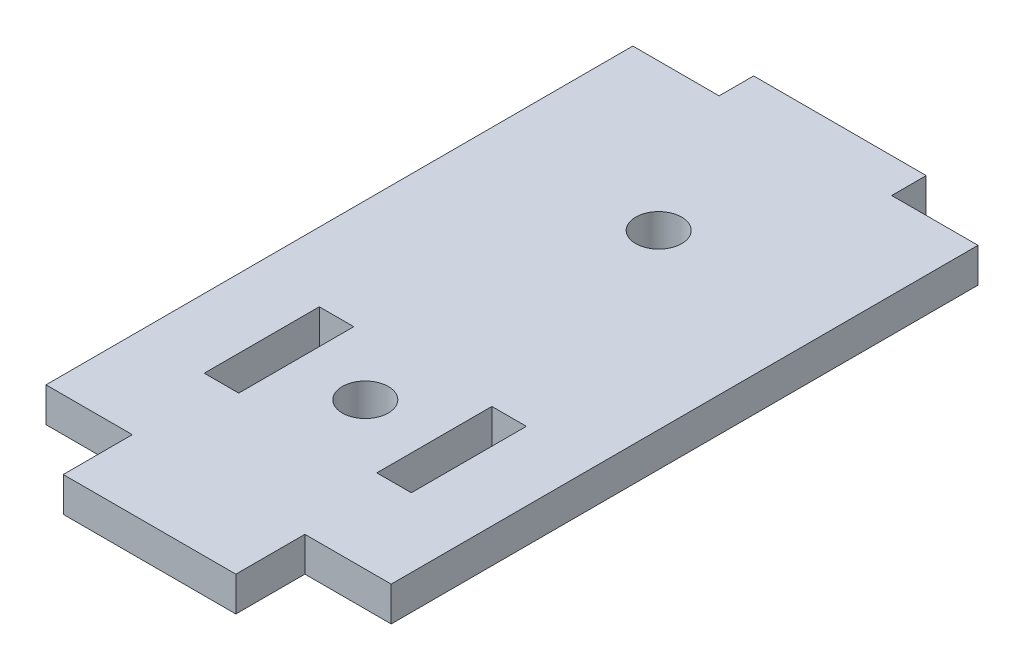
ISO-10303-21;
HEADER;
FILE_DESCRIPTION(('STEP AP214'),'2;1');
FILE_NAME('part.step','',(''),(''),'','','');
FILE_SCHEMA(('AUTOMOTIVE_DESIGN { 1 0 10303 214 1 1 1 1 }'));
ENDSEC;
DATA;
#1=APPLICATION_CONTEXT('core data for automotive mechanical design processes');
#2=APPLICATION_PROTOCOL_DEFINITION('international standard','automotive_design',2000,#1);
#3=PRODUCT_CONTEXT('',#1,'mechanical');
#4=PRODUCT('Part','Part','',(#3));
#5=PRODUCT_RELATED_PRODUCT_CATEGORY('part','',(#4));
#6=PRODUCT_DEFINITION_FORMATION('','',#4);
#7=PRODUCT_DEFINITION_CONTEXT('part definition',#1,'design');
#8=PRODUCT_DEFINITION('design','',#6,#7);
#9=PRODUCT_DEFINITION_SHAPE('','',#8);
#10=(LENGTH_UNIT() NAMED_UNIT(*) SI_UNIT(.MILLI.,.METRE.));
#11=(NAMED_UNIT(*) PLANE_ANGLE_UNIT() SI_UNIT($,.RADIAN.));
#12=(NAMED_UNIT(*) SI_UNIT($,.STERADIAN.) SOLID_ANGLE_UNIT());
#13=UNCERTAINTY_MEASURE_WITH_UNIT(LENGTH_MEASURE(1.E-05),#10,'distance_accuracy_value','');
#14=(GEOMETRIC_REPRESENTATION_CONTEXT(3) GLOBAL_UNCERTAINTY_ASSIGNED_CONTEXT((#13)) GLOBAL_UNIT_ASSIGNED_CONTEXT((#10,
#11,#12)) REPRESENTATION_CONTEXT('',''));
#15=CARTESIAN_POINT('',(0.,0.,0.));
#16=DIRECTION('',(0.,0.,1.));
#17=DIRECTION('',(1.,0.,0.));
#18=AXIS2_PLACEMENT_3D('',#15,#16,#17);
#19=CARTESIAN_POINT('',(0.,3.,17.75));
#20=DIRECTION('',(0.,0.,1.));
#21=DIRECTION('',(1.,0.,0.));
#22=AXIS2_PLACEMENT_3D('',#19,#20,#21);
#23=PLANE('',#22);
#24=DIRECTION('',(-1.,0.,0.));
#25=VECTOR('',#24,1.);
#26=CARTESIAN_POINT('',(0.,0.,17.75));
#27=LINE('',#26,#25);
#28=CARTESIAN_POINT('',(-6.,0.,17.75));
#29=VERTEX_POINT('',#28);
#30=CARTESIAN_POINT('',(-9.,0.,17.75));
#31=VERTEX_POINT('',#30);
#32=EDGE_CURVE('E254',#29,#31,#27,.T.);
#33=ORIENTED_EDGE('',*,*,#32,.T.);
#34=DIRECTION('',(0.,-1.,0.));
#35=VECTOR('',#34,1.);
#36=CARTESIAN_POINT('',(-9.,3.,17.75));
#37=LINE('',#36,#35);
#38=CARTESIAN_POINT('',(-9.,3.,17.75));
#39=VERTEX_POINT('',#38);
#40=EDGE_CURVE('E11',#39,#31,#37,.T.);
#41=ORIENTED_EDGE('',*,*,#40,.F.);
#42=DIRECTION('',(-1.,0.,0.));
#43=VECTOR('',#42,1.);
#44=CARTESIAN_POINT('',(0.,3.,17.75));
#45=LINE('',#44,#43);
#46=CARTESIAN_POINT('',(-6.,3.,17.75));
#47=VERTEX_POINT('',#46);
#48=EDGE_CURVE('E186',#47,#39,#45,.T.);
#49=ORIENTED_EDGE('',*,*,#48,.F.);
#50=DIRECTION('',(0.,-1.,0.));
#51=VECTOR('',#50,1.);
#52=CARTESIAN_POINT('',(-6.,3.,17.75));
#53=LINE('',#52,#51);
#54=EDGE_CURVE('E54',#47,#29,#53,.T.);
#55=ORIENTED_EDGE('',*,*,#54,.T.);
#56=EDGE_LOOP('',(#33,#41,#49,#55));
#57=FACE_BOUND('',#56,.T.);
#58=ADVANCED_FACE('F35',(#57),#23,.F.);
#59=CARTESIAN_POINT('',(-9.,3.,0.));
#60=DIRECTION('',(-1.,0.,0.));
#61=DIRECTION('',(0.,0.,1.));
#62=AXIS2_PLACEMENT_3D('',#59,#60,#61);
#63=PLANE('',#62);
#64=DIRECTION('',(0.,0.,-1.));
#65=VECTOR('',#64,1.);
#66=CARTESIAN_POINT('',(-9.,0.,0.));
#67=LINE('',#66,#65);
#68=CARTESIAN_POINT('',(-9.,0.,7.75));
#69=VERTEX_POINT('',#68);
#70=EDGE_CURVE('E192',#31,#69,#67,.T.);
#71=ORIENTED_EDGE('',*,*,#70,.T.);
#72=DIRECTION('',(0.,-1.,0.));
#73=VECTOR('',#72,1.);
#74=CARTESIAN_POINT('',(-9.,3.,7.75));
#75=LINE('',#74,#73);
#76=CARTESIAN_POINT('',(-9.,3.,7.75));
#77=VERTEX_POINT('',#76);
#78=EDGE_CURVE('E45',#77,#69,#75,.T.);
#79=ORIENTED_EDGE('',*,*,#78,.F.);
#80=DIRECTION('',(0.,0.,-1.));
#81=VECTOR('',#80,1.);
#82=CARTESIAN_POINT('',(-9.,3.,0.));
#83=LINE('',#82,#81);
#84=EDGE_CURVE('E180',#39,#77,#83,.T.);
#85=ORIENTED_EDGE('',*,*,#84,.F.);
#86=ORIENTED_EDGE('',*,*,#40,.T.);
#87=EDGE_LOOP('',(#71,#79,#85,#86));
#88=FACE_BOUND('',#87,.T.);
#89=ADVANCED_FACE('F191',(#88),#63,.F.);
#90=CARTESIAN_POINT('',(0.,3.,7.75));
#91=DIRECTION('',(0.,0.,1.));
#92=DIRECTION('',(1.,0.,0.));
#93=AXIS2_PLACEMENT_3D('',#90,#91,#92);
#94=PLANE('',#93);
#95=DIRECTION('',(-1.,0.,0.));
#96=VECTOR('',#95,1.);
#97=CARTESIAN_POINT('',(0.,0.,7.75));
#98=LINE('',#97,#96);
#99=CARTESIAN_POINT('',(-6.,0.,7.75));
#100=VERTEX_POINT('',#99);
#101=EDGE_CURVE('E257',#100,#69,#98,.T.);
#102=ORIENTED_EDGE('',*,*,#101,.F.);
#103=DIRECTION('',(0.,-1.,0.));
#104=VECTOR('',#103,1.);
#105=CARTESIAN_POINT('',(-6.,3.,7.75));
#106=LINE('',#105,#104);
#107=CARTESIAN_POINT('',(-6.,3.,7.75));
#108=VERTEX_POINT('',#107);
#109=EDGE_CURVE('E116',#108,#100,#106,.T.);
#110=ORIENTED_EDGE('',*,*,#109,.F.);
#111=DIRECTION('',(-1.,0.,0.));
#112=VECTOR('',#111,1.);
#113=CARTESIAN_POINT('',(0.,3.,7.75));
#114=LINE('',#113,#112);
#115=EDGE_CURVE('E185',#108,#77,#114,.T.);
#116=ORIENTED_EDGE('',*,*,#115,.T.);
#117=ORIENTED_EDGE('',*,*,#78,.T.);
#118=EDGE_LOOP('',(#102,#110,#116,#117));
#119=FACE_BOUND('',#118,.T.);
#120=ADVANCED_FACE('F196',(#119),#94,.T.);
#121=CARTESIAN_POINT('',(0.,3.,17.75));
#122=DIRECTION('',(0.,0.,-1.));
#123=DIRECTION('',(-1.,0.,0.));
#124=AXIS2_PLACEMENT_3D('',#121,#122,#123);
#125=PLANE('',#124);
#126=DIRECTION('',(1.,0.,0.));
#127=VECTOR('',#126,1.);
#128=CARTESIAN_POINT('',(0.,0.,17.75));
#129=LINE('',#128,#127);
#130=CARTESIAN_POINT('',(6.,0.,17.75));
#131=VERTEX_POINT('',#130);
#132=CARTESIAN_POINT('',(9.,0.,17.75));
#133=VERTEX_POINT('',#132);
#134=EDGE_CURVE('E236',#131,#133,#129,.T.);
#135=ORIENTED_EDGE('',*,*,#134,.F.);
#136=DIRECTION('',(0.,-1.,0.));
#137=VECTOR('',#136,1.);
#138=CARTESIAN_POINT('',(6.,3.,17.75));
#139=LINE('',#138,#137);
#140=CARTESIAN_POINT('',(6.,3.,17.75));
#141=VERTEX_POINT('',#140);
#142=EDGE_CURVE('E264',#141,#131,#139,.T.);
#143=ORIENTED_EDGE('',*,*,#142,.F.);
#144=DIRECTION('',(1.,0.,0.));
#145=VECTOR('',#144,1.);
#146=CARTESIAN_POINT('',(0.,3.,17.75));
#147=LINE('',#146,#145);
#148=CARTESIAN_POINT('',(9.,3.,17.75));
#149=VERTEX_POINT('',#148);
#150=EDGE_CURVE('E347',#141,#149,#147,.T.);
#151=ORIENTED_EDGE('',*,*,#150,.T.);
#152=DIRECTION('',(0.,-1.,0.));
#153=VECTOR('',#152,1.);
#154=CARTESIAN_POINT('',(9.,3.,17.75));
#155=LINE('',#154,#153);
#156=EDGE_CURVE('E266',#149,#133,#155,.T.);
#157=ORIENTED_EDGE('',*,*,#156,.T.);
#158=EDGE_LOOP('',(#135,#143,#151,#157));
#159=FACE_BOUND('',#158,.T.);
#160=ADVANCED_FACE('F404',(#159),#125,.T.);
#161=CARTESIAN_POINT('',(6.,3.,0.));
#162=DIRECTION('',(-1.,0.,0.));
#163=DIRECTION('',(0.,0.,1.));
#164=AXIS2_PLACEMENT_3D('',#161,#162,#163);
#165=PLANE('',#164);
#166=DIRECTION('',(0.,0.,-1.));
#167=VECTOR('',#166,1.);
#168=CARTESIAN_POINT('',(6.,0.,0.));
#169=LINE('',#168,#167);
#170=CARTESIAN_POINT('',(6.,0.,7.75));
#171=VERTEX_POINT('',#170);
#172=EDGE_CURVE('E239',#131,#171,#169,.T.);
#173=ORIENTED_EDGE('',*,*,#172,.T.);
#174=DIRECTION('',(0.,-1.,0.));
#175=VECTOR('',#174,1.);
#176=CARTESIAN_POINT('',(6.,3.,7.75));
#177=LINE('',#176,#175);
#178=CARTESIAN_POINT('',(6.,3.,7.75));
#179=VERTEX_POINT('',#178);
#180=EDGE_CURVE('E270',#179,#171,#177,.T.);
#181=ORIENTED_EDGE('',*,*,#180,.F.);
#182=DIRECTION('',(0.,0.,-1.));
#183=VECTOR('',#182,1.);
#184=CARTESIAN_POINT('',(6.,3.,0.));
#185=LINE('',#184,#183);
#186=EDGE_CURVE('E350',#141,#179,#185,.T.);
#187=ORIENTED_EDGE('',*,*,#186,.F.);
#188=ORIENTED_EDGE('',*,*,#142,.T.);
#189=EDGE_LOOP('',(#173,#181,#187,#188));
#190=FACE_BOUND('',#189,.T.);
#191=ADVANCED_FACE('F400',(#190),#165,.F.);
#192=CARTESIAN_POINT('',(0.,3.,7.75));
#193=DIRECTION('',(0.,0.,-1.));
#194=DIRECTION('',(-1.,0.,0.));
#195=AXIS2_PLACEMENT_3D('',#192,#193,#194);
#196=PLANE('',#195);
#197=DIRECTION('',(1.,0.,0.));
#198=VECTOR('',#197,1.);
#199=CARTESIAN_POINT('',(0.,0.,7.75));
#200=LINE('',#199,#198);
#201=CARTESIAN_POINT('',(9.,0.,7.75));
#202=VERTEX_POINT('',#201);
#203=EDGE_CURVE('E242',#171,#202,#200,.T.);
#204=ORIENTED_EDGE('',*,*,#203,.T.);
#205=DIRECTION('',(0.,-1.,0.));
#206=VECTOR('',#205,1.);
#207=CARTESIAN_POINT('',(9.,3.,7.75));
#208=LINE('',#207,#206);
#209=CARTESIAN_POINT('',(9.,3.,7.75));
#210=VERTEX_POINT('',#209);
#211=EDGE_CURVE('E268',#210,#202,#208,.T.);
#212=ORIENTED_EDGE('',*,*,#211,.F.);
#213=DIRECTION('',(1.,0.,0.));
#214=VECTOR('',#213,1.);
#215=CARTESIAN_POINT('',(0.,3.,7.75));
#216=LINE('',#215,#214);
#217=EDGE_CURVE('E353',#179,#210,#216,.T.);
#218=ORIENTED_EDGE('',*,*,#217,.F.);
#219=ORIENTED_EDGE('',*,*,#180,.T.);
#220=EDGE_LOOP('',(#204,#212,#218,#219));
#221=FACE_BOUND('',#220,.T.);
#222=ADVANCED_FACE('F397',(#221),#196,.F.);
#223=CARTESIAN_POINT('',(0.,3.,31.5));
#224=DIRECTION('',(0.,0.,1.));
#225=DIRECTION('',(1.,0.,0.));
#226=AXIS2_PLACEMENT_3D('',#223,#224,#225);
#227=PLANE('',#226);
#228=DIRECTION('',(-1.,0.,0.));
#229=VECTOR('',#228,1.);
#230=CARTESIAN_POINT('',(0.,0.,31.5));
#231=LINE('',#230,#229);
#232=CARTESIAN_POINT('',(7.5,0.,31.5));
#233=VERTEX_POINT('',#232);
#234=CARTESIAN_POINT('',(-7.5,0.,31.5));
#235=VERTEX_POINT('',#234);
#236=EDGE_CURVE('E203',#233,#235,#231,.T.);
#237=ORIENTED_EDGE('',*,*,#236,.F.);
#238=DIRECTION('',(0.,-1.,0.));
#239=VECTOR('',#238,1.);
#240=CARTESIAN_POINT('',(7.5,3.,31.5));
#241=LINE('',#240,#239);
#242=CARTESIAN_POINT('',(7.5,3.,31.5));
#243=VERTEX_POINT('',#242);
#244=EDGE_CURVE('E39',#243,#233,#241,.T.);
#245=ORIENTED_EDGE('',*,*,#244,.F.);
#246=DIRECTION('',(-1.,0.,0.));
#247=VECTOR('',#246,1.);
#248=CARTESIAN_POINT('',(0.,3.,31.5));
#249=LINE('',#248,#247);
#250=CARTESIAN_POINT('',(-7.5,3.,31.5));
#251=VERTEX_POINT('',#250);
#252=EDGE_CURVE('E262',#243,#251,#249,.T.);
#253=ORIENTED_EDGE('',*,*,#252,.T.);
#254=DIRECTION('',(0.,-1.,0.));
#255=VECTOR('',#254,1.);
#256=CARTESIAN_POINT('',(-7.5,3.,31.5));
#257=LINE('',#256,#255);
#258=EDGE_CURVE('E199',#251,#235,#257,.T.);
#259=ORIENTED_EDGE('',*,*,#258,.T.);
#260=EDGE_LOOP('',(#237,#245,#253,#259));
#261=FACE_BOUND('',#260,.T.);
#262=ADVANCED_FACE('F37',(#261),#227,.T.);
#263=CARTESIAN_POINT('',(7.5,3.,0.));
#264=DIRECTION('',(1.,0.,0.));
#265=DIRECTION('',(0.,0.,-1.));
#266=AXIS2_PLACEMENT_3D('',#263,#264,#265);
#267=PLANE('',#266);
#268=DIRECTION('',(0.,0.,1.));
#269=VECTOR('',#268,1.);
#270=CARTESIAN_POINT('',(7.5,0.,0.));
#271=LINE('',#270,#269);
#272=CARTESIAN_POINT('',(7.5,0.,25.5));
#273=VERTEX_POINT('',#272);
#274=EDGE_CURVE('E206',#273,#233,#271,.T.);
#275=ORIENTED_EDGE('',*,*,#274,.F.);
#276=DIRECTION('',(0.,-1.,0.));
#277=VECTOR('',#276,1.);
#278=CARTESIAN_POINT('',(7.5,3.,25.5));
#279=LINE('',#278,#277);
#280=CARTESIAN_POINT('',(7.5,3.,25.5));
#281=VERTEX_POINT('',#280);
#282=EDGE_CURVE('E295',#281,#273,#279,.T.);
#283=ORIENTED_EDGE('',*,*,#282,.F.);
#284=DIRECTION('',(0.,0.,1.));
#285=VECTOR('',#284,1.);
#286=CARTESIAN_POINT('',(7.5,3.,0.));
#287=LINE('',#286,#285);
#288=EDGE_CURVE('E304',#281,#243,#287,.T.);
#289=ORIENTED_EDGE('',*,*,#288,.T.);
#290=ORIENTED_EDGE('',*,*,#244,.T.);
#291=EDGE_LOOP('',(#275,#283,#289,#290));
#292=FACE_BOUND('',#291,.T.);
#293=ADVANCED_FACE('F302',(#292),#267,.T.);
#294=CARTESIAN_POINT('',(0.,3.,25.5));
#295=DIRECTION('',(0.,0.,1.));
#296=DIRECTION('',(1.,0.,0.));
#297=AXIS2_PLACEMENT_3D('',#294,#295,#296);
#298=PLANE('',#297);
#299=DIRECTION('',(-1.,0.,0.));
#300=VECTOR('',#299,1.);
#301=CARTESIAN_POINT('',(0.,0.,25.5));
#302=LINE('',#301,#300);
#303=CARTESIAN_POINT('',(15.,0.,25.5));
#304=VERTEX_POINT('',#303);
#305=EDGE_CURVE('E209',#304,#273,#302,.T.);
#306=ORIENTED_EDGE('',*,*,#305,.F.);
#307=DIRECTION('',(0.,-1.,0.));
#308=VECTOR('',#307,1.);
#309=CARTESIAN_POINT('',(15.,3.,25.5));
#310=LINE('',#309,#308);
#311=CARTESIAN_POINT('',(15.,3.,25.5));
#312=VERTEX_POINT('',#311);
#313=EDGE_CURVE('E294',#312,#304,#310,.T.);
#314=ORIENTED_EDGE('',*,*,#313,.F.);
#315=DIRECTION('',(-1.,0.,0.));
#316=VECTOR('',#315,1.);
#317=CARTESIAN_POINT('',(0.,3.,25.5));
#318=LINE('',#317,#316);
#319=EDGE_CURVE('E315',#312,#281,#318,.T.);
#320=ORIENTED_EDGE('',*,*,#319,.T.);
#321=ORIENTED_EDGE('',*,*,#282,.T.);
#322=EDGE_LOOP('',(#306,#314,#320,#321));
#323=FACE_BOUND('',#322,.T.);
#324=ADVANCED_FACE('F312',(#323),#298,.T.);
#325=CARTESIAN_POINT('',(15.,3.,0.));
#326=DIRECTION('',(-1.,0.,0.));
#327=DIRECTION('',(0.,0.,1.));
#328=AXIS2_PLACEMENT_3D('',#325,#326,#327);
#329=PLANE('',#328);
#330=DIRECTION('',(0.,0.,-1.));
#331=VECTOR('',#330,1.);
#332=CARTESIAN_POINT('',(15.,0.,0.));
#333=LINE('',#332,#331);
#334=CARTESIAN_POINT('',(15.,0.,-25.5));
#335=VERTEX_POINT('',#334);
#336=EDGE_CURVE('E212',#304,#335,#333,.T.);
#337=ORIENTED_EDGE('',*,*,#336,.T.);
#338=DIRECTION('',(0.,-1.,0.));
#339=VECTOR('',#338,1.);
#340=CARTESIAN_POINT('',(15.,3.,-25.5));
#341=LINE('',#340,#339);
#342=CARTESIAN_POINT('',(15.,3.,-25.5));
#343=VERTEX_POINT('',#342);
#344=EDGE_CURVE('E291',#343,#335,#341,.T.);
#345=ORIENTED_EDGE('',*,*,#344,.F.);
#346=DIRECTION('',(0.,0.,-1.));
#347=VECTOR('',#346,1.);
#348=CARTESIAN_POINT('',(15.,3.,0.));
#349=LINE('',#348,#347);
#350=EDGE_CURVE('E318',#312,#343,#349,.T.);
#351=ORIENTED_EDGE('',*,*,#350,.F.);
#352=ORIENTED_EDGE('',*,*,#313,.T.);
#353=EDGE_LOOP('',(#337,#345,#351,#352));
#354=FACE_BOUND('',#353,.T.);
#355=ADVANCED_FACE('F319',(#354),#329,.F.);
#356=CARTESIAN_POINT('',(0.,3.,-25.5));
#357=DIRECTION('',(0.,0.,1.));
#358=DIRECTION('',(1.,0.,0.));
#359=AXIS2_PLACEMENT_3D('',#356,#357,#358);
#360=PLANE('',#359);
#361=DIRECTION('',(-1.,0.,0.));
#362=VECTOR('',#361,1.);
#363=CARTESIAN_POINT('',(0.,0.,-25.5));
#364=LINE('',#363,#362);
#365=CARTESIAN_POINT('',(7.5,0.,-25.5));
#366=VERTEX_POINT('',#365);
#367=EDGE_CURVE('E214',#335,#366,#364,.T.);
#368=ORIENTED_EDGE('',*,*,#367,.T.);
#369=DIRECTION('',(0.,-1.,0.));
#370=VECTOR('',#369,1.);
#371=CARTESIAN_POINT('',(7.5,3.,-25.5));
#372=LINE('',#371,#370);
#373=CARTESIAN_POINT('',(7.5,3.,-25.5));
#374=VERTEX_POINT('',#373);
#375=EDGE_CURVE('E289',#374,#366,#372,.T.);
#376=ORIENTED_EDGE('',*,*,#375,.F.);
#377=DIRECTION('',(-1.,0.,0.));
#378=VECTOR('',#377,1.);
#379=CARTESIAN_POINT('',(0.,3.,-25.5));
#380=LINE('',#379,#378);
#381=EDGE_CURVE('E322',#343,#374,#380,.T.);
#382=ORIENTED_EDGE('',*,*,#381,.F.);
#383=ORIENTED_EDGE('',*,*,#344,.T.);
#384=EDGE_LOOP('',(#368,#376,#382,#383));
#385=FACE_BOUND('',#384,.T.);
#386=ADVANCED_FACE('F434',(#385),#360,.F.);
#387=CARTESIAN_POINT('',(7.5,3.,0.));
#388=DIRECTION('',(1.,0.,0.));
#389=DIRECTION('',(0.,0.,-1.));
#390=AXIS2_PLACEMENT_3D('',#387,#388,#389);
#391=PLANE('',#390);
#392=DIRECTION('',(0.,0.,1.));
#393=VECTOR('',#392,1.);
#394=CARTESIAN_POINT('',(7.5,0.,0.));
#395=LINE('',#394,#393);
#396=CARTESIAN_POINT('',(7.5,0.,-28.5));
#397=VERTEX_POINT('',#396);
#398=EDGE_CURVE('E217',#397,#366,#395,.T.);
#399=ORIENTED_EDGE('',*,*,#398,.F.);
#400=DIRECTION('',(0.,-1.,0.));
#401=VECTOR('',#400,1.);
#402=CARTESIAN_POINT('',(7.5,3.,-28.5));
#403=LINE('',#402,#401);
#404=CARTESIAN_POINT('',(7.5,3.,-28.5));
#405=VERTEX_POINT('',#404);
#406=EDGE_CURVE('E287',#405,#397,#403,.T.);
#407=ORIENTED_EDGE('',*,*,#406,.F.);
#408=DIRECTION('',(0.,0.,1.));
#409=VECTOR('',#408,1.);
#410=CARTESIAN_POINT('',(7.5,3.,0.));
#411=LINE('',#410,#409);
#412=EDGE_CURVE('E330',#405,#374,#411,.T.);
#413=ORIENTED_EDGE('',*,*,#412,.T.);
#414=ORIENTED_EDGE('',*,*,#375,.T.);
#415=EDGE_LOOP('',(#399,#407,#413,#414));
#416=FACE_BOUND('',#415,.T.);
#417=ADVANCED_FACE('F430',(#416),#391,.T.);
#418=CARTESIAN_POINT('',(0.,3.,-28.5));
#419=DIRECTION('',(0.,0.,1.));
#420=DIRECTION('',(1.,0.,0.));
#421=AXIS2_PLACEMENT_3D('',#418,#419,#420);
#422=PLANE('',#421);
#423=DIRECTION('',(-1.,0.,0.));
#424=VECTOR('',#423,1.);
#425=CARTESIAN_POINT('',(0.,0.,-28.5));
#426=LINE('',#425,#424);
#427=CARTESIAN_POINT('',(-7.5,0.,-28.5));
#428=VERTEX_POINT('',#427);
#429=EDGE_CURVE('E220',#397,#428,#426,.T.);
#430=ORIENTED_EDGE('',*,*,#429,.T.);
#431=DIRECTION('',(0.,-1.,0.));
#432=VECTOR('',#431,1.);
#433=CARTESIAN_POINT('',(-7.5,3.,-28.5));
#434=LINE('',#433,#432);
#435=CARTESIAN_POINT('',(-7.5,3.,-28.5));
#436=VERTEX_POINT('',#435);
#437=EDGE_CURVE('E284',#436,#428,#434,.T.);
#438=ORIENTED_EDGE('',*,*,#437,.F.);
#439=DIRECTION('',(-1.,0.,0.));
#440=VECTOR('',#439,1.);
#441=CARTESIAN_POINT('',(0.,3.,-28.5));
#442=LINE('',#441,#440);
#443=EDGE_CURVE('E333',#405,#436,#442,.T.);
#444=ORIENTED_EDGE('',*,*,#443,.F.);
#445=ORIENTED_EDGE('',*,*,#406,.T.);
#446=EDGE_LOOP('',(#430,#438,#444,#445));
#447=FACE_BOUND('',#446,.T.);
#448=ADVANCED_FACE('F426',(#447),#422,.F.);
#449=CARTESIAN_POINT('',(-7.5,3.,0.));
#450=DIRECTION('',(1.,0.,0.));
#451=DIRECTION('',(0.,0.,-1.));
#452=AXIS2_PLACEMENT_3D('',#449,#450,#451);
#453=PLANE('',#452);
#454=DIRECTION('',(0.,0.,1.));
#455=VECTOR('',#454,1.);
#456=CARTESIAN_POINT('',(-7.5,0.,0.));
#457=LINE('',#456,#455);
#458=CARTESIAN_POINT('',(-7.5,0.,-25.5));
#459=VERTEX_POINT('',#458);
#460=EDGE_CURVE('E222',#428,#459,#457,.T.);
#461=ORIENTED_EDGE('',*,*,#460,.T.);
#462=DIRECTION('',(0.,-1.,0.));
#463=VECTOR('',#462,1.);
#464=CARTESIAN_POINT('',(-7.5,3.,-25.5));
#465=LINE('',#464,#463);
#466=CARTESIAN_POINT('',(-7.5,3.,-25.5));
#467=VERTEX_POINT('',#466);
#468=EDGE_CURVE('E281',#467,#459,#465,.T.);
#469=ORIENTED_EDGE('',*,*,#468,.F.);
#470=DIRECTION('',(0.,0.,1.));
#471=VECTOR('',#470,1.);
#472=CARTESIAN_POINT('',(-7.5,3.,0.));
#473=LINE('',#472,#471);
#474=EDGE_CURVE('E335',#436,#467,#473,.T.);
#475=ORIENTED_EDGE('',*,*,#474,.F.);
#476=ORIENTED_EDGE('',*,*,#437,.T.);
#477=EDGE_LOOP('',(#461,#469,#475,#476));
#478=FACE_BOUND('',#477,.T.);
#479=ADVANCED_FACE('F422',(#478),#453,.F.);
#480=CARTESIAN_POINT('',(0.,3.,-25.5));
#481=DIRECTION('',(0.,0.,1.));
#482=DIRECTION('',(1.,0.,0.));
#483=AXIS2_PLACEMENT_3D('',#480,#481,#482);
#484=PLANE('',#483);
#485=DIRECTION('',(-1.,0.,0.));
#486=VECTOR('',#485,1.);
#487=CARTESIAN_POINT('',(0.,0.,-25.5));
#488=LINE('',#487,#486);
#489=CARTESIAN_POINT('',(-15.,0.,-25.5));
#490=VERTEX_POINT('',#489);
#491=EDGE_CURVE('E224',#459,#490,#488,.T.);
#492=ORIENTED_EDGE('',*,*,#491,.T.);
#493=DIRECTION('',(0.,-1.,0.));
#494=VECTOR('',#493,1.);
#495=CARTESIAN_POINT('',(-15.,3.,-25.5));
#496=LINE('',#495,#494);
#497=CARTESIAN_POINT('',(-15.,3.,-25.5));
#498=VERTEX_POINT('',#497);
#499=EDGE_CURVE('E279',#498,#490,#496,.T.);
#500=ORIENTED_EDGE('',*,*,#499,.F.);
#501=DIRECTION('',(-1.,0.,0.));
#502=VECTOR('',#501,1.);
#503=CARTESIAN_POINT('',(0.,3.,-25.5));
#504=LINE('',#503,#502);
#505=EDGE_CURVE('E337',#467,#498,#504,.T.);
#506=ORIENTED_EDGE('',*,*,#505,.F.);
#507=ORIENTED_EDGE('',*,*,#468,.T.);
#508=EDGE_LOOP('',(#492,#500,#506,#507));
#509=FACE_BOUND('',#508,.T.);
#510=ADVANCED_FACE('F418',(#509),#484,.F.);
#511=CARTESIAN_POINT('',(-15.,3.,0.));
#512=DIRECTION('',(-1.,0.,0.));
#513=DIRECTION('',(0.,0.,1.));
#514=AXIS2_PLACEMENT_3D('',#511,#512,#513);
#515=PLANE('',#514);
#516=DIRECTION('',(0.,0.,-1.));
#517=VECTOR('',#516,1.);
#518=CARTESIAN_POINT('',(-15.,0.,0.));
#519=LINE('',#518,#517);
#520=CARTESIAN_POINT('',(-15.,0.,25.5));
#521=VERTEX_POINT('',#520);
#522=EDGE_CURVE('E227',#521,#490,#519,.T.);
#523=ORIENTED_EDGE('',*,*,#522,.F.);
#524=DIRECTION('',(0.,-1.,0.));
#525=VECTOR('',#524,1.);
#526=CARTESIAN_POINT('',(-15.,3.,25.5));
#527=LINE('',#526,#525);
#528=CARTESIAN_POINT('',(-15.,3.,25.5));
#529=VERTEX_POINT('',#528);
#530=EDGE_CURVE('E277',#529,#521,#527,.T.);
#531=ORIENTED_EDGE('',*,*,#530,.F.);
#532=DIRECTION('',(0.,0.,-1.));
#533=VECTOR('',#532,1.);
#534=CARTESIAN_POINT('',(-15.,3.,0.));
#535=LINE('',#534,#533);
#536=EDGE_CURVE('E339',#529,#498,#535,.T.);
#537=ORIENTED_EDGE('',*,*,#536,.T.);
#538=ORIENTED_EDGE('',*,*,#499,.T.);
#539=EDGE_LOOP('',(#523,#531,#537,#538));
#540=FACE_BOUND('',#539,.T.);
#541=ADVANCED_FACE('F414',(#540),#515,.T.);
#542=CARTESIAN_POINT('',(0.,3.,25.5));
#543=DIRECTION('',(0.,0.,1.));
#544=DIRECTION('',(1.,0.,0.));
#545=AXIS2_PLACEMENT_3D('',#542,#543,#544);
#546=PLANE('',#545);
#547=DIRECTION('',(-1.,0.,0.));
#548=VECTOR('',#547,1.);
#549=CARTESIAN_POINT('',(0.,0.,25.5));
#550=LINE('',#549,#548);
#551=CARTESIAN_POINT('',(-7.5,0.,25.5));
#552=VERTEX_POINT('',#551);
#553=EDGE_CURVE('E230',#552,#521,#550,.T.);
#554=ORIENTED_EDGE('',*,*,#553,.F.);
#555=DIRECTION('',(0.,-1.,0.));
#556=VECTOR('',#555,1.);
#557=CARTESIAN_POINT('',(-7.5,3.,25.5));
#558=LINE('',#557,#556);
#559=CARTESIAN_POINT('',(-7.5,3.,25.5));
#560=VERTEX_POINT('',#559);
#561=EDGE_CURVE('E275',#560,#552,#558,.T.);
#562=ORIENTED_EDGE('',*,*,#561,.F.);
#563=DIRECTION('',(-1.,0.,0.));
#564=VECTOR('',#563,1.);
#565=CARTESIAN_POINT('',(0.,3.,25.5));
#566=LINE('',#565,#564);
#567=EDGE_CURVE('E342',#560,#529,#566,.T.);
#568=ORIENTED_EDGE('',*,*,#567,.T.);
#569=ORIENTED_EDGE('',*,*,#530,.T.);
#570=EDGE_LOOP('',(#554,#562,#568,#569));
#571=FACE_BOUND('',#570,.T.);
#572=ADVANCED_FACE('F389',(#571),#546,.T.);
#573=CARTESIAN_POINT('',(0.,3.,-12.75));
#574=DIRECTION('',(0.,-1.,0.));
#575=DIRECTION('',(0.,0.,-1.));
#576=AXIS2_PLACEMENT_3D('',#573,#574,#575);
#577=CYLINDRICAL_SURFACE('',#576,2.);
#578=CARTESIAN_POINT('',(0.,3.,-12.75));
#579=DIRECTION('',(0.,1.,0.));
#580=DIRECTION('',(0.,0.,1.));
#581=AXIS2_PLACEMENT_3D('',#578,#579,#580);
#582=CIRCLE('',#581,2.);
#583=CARTESIAN_POINT('',(0.,3.,-10.75));
#584=VERTEX_POINT('',#583);
#585=EDGE_CURVE('E361',#584,#584,#582,.T.);
#586=ORIENTED_EDGE('',*,*,#585,.T.);
#587=EDGE_LOOP('',(#586));
#588=FACE_BOUND('',#587,.T.);
#589=CARTESIAN_POINT('',(0.,0.,-12.75));
#590=DIRECTION('',(0.,1.,0.));
#591=DIRECTION('',(0.,0.,1.));
#592=AXIS2_PLACEMENT_3D('',#589,#590,#591);
#593=CIRCLE('',#592,2.);
#594=CARTESIAN_POINT('',(0.,0.,-10.75));
#595=VERTEX_POINT('',#594);
#596=EDGE_CURVE('E251',#595,#595,#593,.T.);
#597=ORIENTED_EDGE('',*,*,#596,.F.);
#598=EDGE_LOOP('',(#597));
#599=FACE_BOUND('',#598,.T.);
#600=ADVANCED_FACE('F365',(#588,#599),#577,.F.);
#601=CARTESIAN_POINT('',(0.,3.,12.75));
#602=DIRECTION('',(0.,-1.,0.));
#603=DIRECTION('',(0.,0.,-1.));
#604=AXIS2_PLACEMENT_3D('',#601,#602,#603);
#605=CYLINDRICAL_SURFACE('',#604,2.);
#606=CARTESIAN_POINT('',(0.,3.,12.75));
#607=DIRECTION('',(0.,1.,0.));
#608=DIRECTION('',(0.,0.,1.));
#609=AXIS2_PLACEMENT_3D('',#606,#607,#608);
#610=CIRCLE('',#609,2.);
#611=CARTESIAN_POINT('',(0.,3.,14.75));
#612=VERTEX_POINT('',#611);
#613=EDGE_CURVE('E358',#612,#612,#610,.T.);
#614=ORIENTED_EDGE('',*,*,#613,.T.);
#615=EDGE_LOOP('',(#614));
#616=FACE_BOUND('',#615,.T.);
#617=CARTESIAN_POINT('',(0.,0.,12.75));
#618=DIRECTION('',(0.,1.,0.));
#619=DIRECTION('',(0.,0.,1.));
#620=AXIS2_PLACEMENT_3D('',#617,#618,#619);
#621=CIRCLE('',#620,2.);
#622=CARTESIAN_POINT('',(0.,0.,14.75));
#623=VERTEX_POINT('',#622);
#624=EDGE_CURVE('E248',#623,#623,#621,.T.);
#625=ORIENTED_EDGE('',*,*,#624,.F.);
#626=EDGE_LOOP('',(#625));
#627=FACE_BOUND('',#626,.T.);
#628=ADVANCED_FACE('F388',(#616,#627),#605,.F.);
#629=CARTESIAN_POINT('',(9.,3.,0.));
#630=DIRECTION('',(-1.,0.,0.));
#631=DIRECTION('',(0.,0.,1.));
#632=AXIS2_PLACEMENT_3D('',#629,#630,#631);
#633=PLANE('',#632);
#634=DIRECTION('',(0.,0.,-1.));
#635=VECTOR('',#634,1.);
#636=CARTESIAN_POINT('',(9.,0.,0.));
#637=LINE('',#636,#635);
#638=EDGE_CURVE('E245',#133,#202,#637,.T.);
#639=ORIENTED_EDGE('',*,*,#638,.F.);
#640=ORIENTED_EDGE('',*,*,#156,.F.);
#641=DIRECTION('',(0.,0.,-1.));
#642=VECTOR('',#641,1.);
#643=CARTESIAN_POINT('',(9.,3.,0.));
#644=LINE('',#643,#642);
#645=EDGE_CURVE('E355',#149,#210,#644,.T.);
#646=ORIENTED_EDGE('',*,*,#645,.T.);
#647=ORIENTED_EDGE('',*,*,#211,.T.);
#648=EDGE_LOOP('',(#639,#640,#646,#647));
#649=FACE_BOUND('',#648,.T.);
#650=ADVANCED_FACE('F392',(#649),#633,.T.);
#651=CARTESIAN_POINT('',(-7.5,3.,0.));
#652=DIRECTION('',(1.,0.,0.));
#653=DIRECTION('',(0.,0.,-1.));
#654=AXIS2_PLACEMENT_3D('',#651,#652,#653);
#655=PLANE('',#654);
#656=DIRECTION('',(0.,0.,1.));
#657=VECTOR('',#656,1.);
#658=CARTESIAN_POINT('',(-7.5,0.,0.));
#659=LINE('',#658,#657);
#660=EDGE_CURVE('E233',#552,#235,#659,.T.);
#661=ORIENTED_EDGE('',*,*,#660,.T.);
#662=ORIENTED_EDGE('',*,*,#258,.F.);
#663=DIRECTION('',(0.,0.,1.));
#664=VECTOR('',#663,1.);
#665=CARTESIAN_POINT('',(-7.5,3.,0.));
#666=LINE('',#665,#664);
#667=EDGE_CURVE('E345',#560,#251,#666,.T.);
#668=ORIENTED_EDGE('',*,*,#667,.F.);
#669=ORIENTED_EDGE('',*,*,#561,.T.);
#670=EDGE_LOOP('',(#661,#662,#668,#669));
#671=FACE_BOUND('',#670,.T.);
#672=ADVANCED_FACE('F376',(#671),#655,.F.);
#673=CARTESIAN_POINT('',(-6.,3.,0.));
#674=DIRECTION('',(-1.,0.,0.));
#675=DIRECTION('',(0.,0.,1.));
#676=AXIS2_PLACEMENT_3D('',#673,#674,#675);
#677=PLANE('',#676);
#678=DIRECTION('',(0.,0.,-1.));
#679=VECTOR('',#678,1.);
#680=CARTESIAN_POINT('',(-6.,0.,0.));
#681=LINE('',#680,#679);
#682=EDGE_CURVE('E259',#29,#100,#681,.T.);
#683=ORIENTED_EDGE('',*,*,#682,.F.);
#684=ORIENTED_EDGE('',*,*,#54,.F.);
#685=DIRECTION('',(0.,0.,-1.));
#686=VECTOR('',#685,1.);
#687=CARTESIAN_POINT('',(-6.,3.,0.));
#688=LINE('',#687,#686);
#689=EDGE_CURVE('E197',#47,#108,#688,.T.);
#690=ORIENTED_EDGE('',*,*,#689,.T.);
#691=ORIENTED_EDGE('',*,*,#109,.T.);
#692=EDGE_LOOP('',(#683,#684,#690,#691));
#693=FACE_BOUND('',#692,.T.);
#694=ADVANCED_FACE('F369',(#693),#677,.T.);
#695=CARTESIAN_POINT('',(0.,3.,0.));
#696=DIRECTION('',(0.,1.,0.));
#697=DIRECTION('',(0.,0.,1.));
#698=AXIS2_PLACEMENT_3D('',#695,#696,#697);
#699=PLANE('',#698);
#700=ORIENTED_EDGE('',*,*,#252,.F.);
#701=ORIENTED_EDGE('',*,*,#288,.F.);
#702=ORIENTED_EDGE('',*,*,#319,.F.);
#703=ORIENTED_EDGE('',*,*,#350,.T.);
#704=ORIENTED_EDGE('',*,*,#381,.T.);
#705=ORIENTED_EDGE('',*,*,#412,.F.);
#706=ORIENTED_EDGE('',*,*,#443,.T.);
#707=ORIENTED_EDGE('',*,*,#474,.T.);
#708=ORIENTED_EDGE('',*,*,#505,.T.);
#709=ORIENTED_EDGE('',*,*,#536,.F.);
#710=ORIENTED_EDGE('',*,*,#567,.F.);
#711=ORIENTED_EDGE('',*,*,#667,.T.);
#712=EDGE_LOOP('',(#700,#701,#702,#703,#704,#705,#706,#707,#708,#709,#710,#711));
#713=FACE_BOUND('',#712,.T.);
#714=ORIENTED_EDGE('',*,*,#150,.F.);
#715=ORIENTED_EDGE('',*,*,#186,.T.);
#716=ORIENTED_EDGE('',*,*,#217,.T.);
#717=ORIENTED_EDGE('',*,*,#645,.F.);
#718=EDGE_LOOP('',(#714,#715,#716,#717));
#719=FACE_BOUND('',#718,.T.);
#720=ORIENTED_EDGE('',*,*,#613,.F.);
#721=EDGE_LOOP('',(#720));
#722=FACE_BOUND('',#721,.T.);
#723=ORIENTED_EDGE('',*,*,#585,.F.);
#724=EDGE_LOOP('',(#723));
#725=FACE_BOUND('',#724,.T.);
#726=ORIENTED_EDGE('',*,*,#48,.T.);
#727=ORIENTED_EDGE('',*,*,#84,.T.);
#728=ORIENTED_EDGE('',*,*,#115,.F.);
#729=ORIENTED_EDGE('',*,*,#689,.F.);
#730=EDGE_LOOP('',(#726,#727,#728,#729));
#731=FACE_BOUND('',#730,.T.);
#732=ADVANCED_FACE('F182',(#713,#719,#722,#725,#731),#699,.T.);
#733=CARTESIAN_POINT('',(0.,0.,0.));
#734=DIRECTION('',(0.,1.,0.));
#735=DIRECTION('',(0.,0.,1.));
#736=AXIS2_PLACEMENT_3D('',#733,#734,#735);
#737=PLANE('',#736);
#738=ORIENTED_EDGE('',*,*,#236,.T.);
#739=ORIENTED_EDGE('',*,*,#660,.F.);
#740=ORIENTED_EDGE('',*,*,#553,.T.);
#741=ORIENTED_EDGE('',*,*,#522,.T.);
#742=ORIENTED_EDGE('',*,*,#491,.F.);
#743=ORIENTED_EDGE('',*,*,#460,.F.);
#744=ORIENTED_EDGE('',*,*,#429,.F.);
#745=ORIENTED_EDGE('',*,*,#398,.T.);
#746=ORIENTED_EDGE('',*,*,#367,.F.);
#747=ORIENTED_EDGE('',*,*,#336,.F.);
#748=ORIENTED_EDGE('',*,*,#305,.T.);
#749=ORIENTED_EDGE('',*,*,#274,.T.);
#750=EDGE_LOOP('',(#738,#739,#740,#741,#742,#743,#744,#745,#746,#747,#748,#749));
#751=FACE_BOUND('',#750,.T.);
#752=ORIENTED_EDGE('',*,*,#134,.T.);
#753=ORIENTED_EDGE('',*,*,#638,.T.);
#754=ORIENTED_EDGE('',*,*,#203,.F.);
#755=ORIENTED_EDGE('',*,*,#172,.F.);
#756=EDGE_LOOP('',(#752,#753,#754,#755));
#757=FACE_BOUND('',#756,.T.);
#758=ORIENTED_EDGE('',*,*,#624,.T.);
#759=EDGE_LOOP('',(#758));
#760=FACE_BOUND('',#759,.T.);
#761=ORIENTED_EDGE('',*,*,#596,.T.);
#762=EDGE_LOOP('',(#761));
#763=FACE_BOUND('',#762,.T.);
#764=ORIENTED_EDGE('',*,*,#32,.F.);
#765=ORIENTED_EDGE('',*,*,#682,.T.);
#766=ORIENTED_EDGE('',*,*,#101,.T.);
#767=ORIENTED_EDGE('',*,*,#70,.F.);
#768=EDGE_LOOP('',(#764,#765,#766,#767));
#769=FACE_BOUND('',#768,.T.);
#770=ADVANCED_FACE('F308',(#751,#757,#760,#763,#769),#737,.F.);
#771=CLOSED_SHELL('',(#58,#89,#120,#160,#191,#222,#262,#293,#324,#355,#386,#417,#448,#479,#510,
#541,#572,#600,#628,#650,#672,#694,#732,#770));
#772=MANIFOLD_SOLID_BREP('B2',#771);
#773=ADVANCED_BREP_SHAPE_REPRESENTATION('',(#18,#772),#14);
#774=SHAPE_DEFINITION_REPRESENTATION(#9,#773);
ENDSEC;
END-ISO-10303-21;
